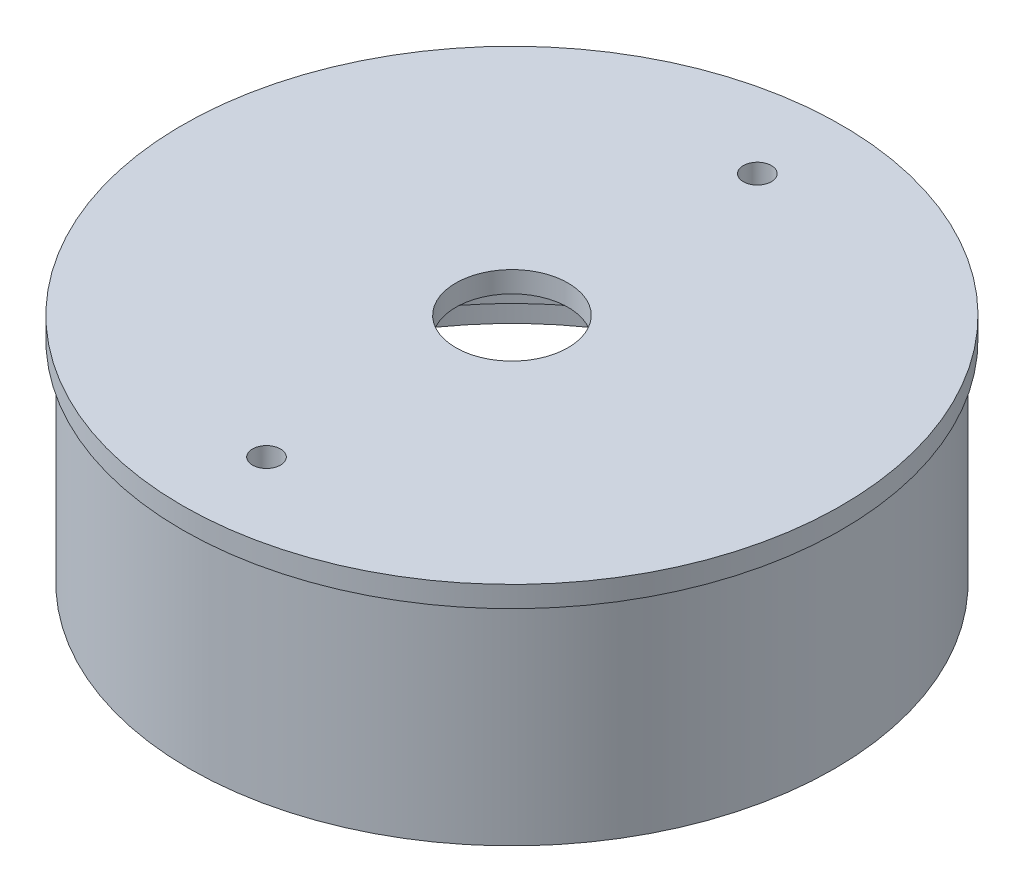
ISO-10303-21;
HEADER;
FILE_DESCRIPTION(('STEP AP214'),'2;1');
FILE_NAME('part.step','',(''),(''),'','','');
FILE_SCHEMA(('AUTOMOTIVE_DESIGN { 1 0 10303 214 1 1 1 1 }'));
ENDSEC;
DATA;
#1=APPLICATION_CONTEXT('core data for automotive mechanical design processes');
#2=APPLICATION_PROTOCOL_DEFINITION('international standard','automotive_design',2000,#1);
#3=PRODUCT_CONTEXT('',#1,'mechanical');
#4=PRODUCT('Part','Part','',(#3));
#5=PRODUCT_RELATED_PRODUCT_CATEGORY('part','',(#4));
#6=PRODUCT_DEFINITION_FORMATION('','',#4);
#7=PRODUCT_DEFINITION_CONTEXT('part definition',#1,'design');
#8=PRODUCT_DEFINITION('design','',#6,#7);
#9=PRODUCT_DEFINITION_SHAPE('','',#8);
#10=(LENGTH_UNIT() NAMED_UNIT(*) SI_UNIT(.MILLI.,.METRE.));
#11=(NAMED_UNIT(*) PLANE_ANGLE_UNIT() SI_UNIT($,.RADIAN.));
#12=(NAMED_UNIT(*) SI_UNIT($,.STERADIAN.) SOLID_ANGLE_UNIT());
#13=UNCERTAINTY_MEASURE_WITH_UNIT(LENGTH_MEASURE(1.E-05),#10,'distance_accuracy_value','');
#14=(GEOMETRIC_REPRESENTATION_CONTEXT(3) GLOBAL_UNCERTAINTY_ASSIGNED_CONTEXT((#13)) GLOBAL_UNIT_ASSIGNED_CONTEXT((#10,
#11,#12)) REPRESENTATION_CONTEXT('',''));
#15=CARTESIAN_POINT('',(0.,0.,0.));
#16=DIRECTION('',(0.,0.,1.));
#17=DIRECTION('',(1.,0.,0.));
#18=AXIS2_PLACEMENT_3D('',#15,#16,#17);
#19=CARTESIAN_POINT('',(0.,30.,0.));
#20=DIRECTION('',(0.,1.,0.));
#21=DIRECTION('',(0.,0.,1.));
#22=AXIS2_PLACEMENT_3D('',#19,#20,#21);
#23=PLANE('',#22);
#24=CARTESIAN_POINT('',(0.,30.,0.));
#25=DIRECTION('',(0.,1.,0.));
#26=DIRECTION('',(0.,0.,1.));
#27=AXIS2_PLACEMENT_3D('',#24,#25,#26);
#28=CIRCLE('',#27,8.);
#29=CARTESIAN_POINT('',(0.,30.,8.));
#30=VERTEX_POINT('',#29);
#31=EDGE_CURVE('E63',#30,#30,#28,.T.);
#32=ORIENTED_EDGE('',*,*,#31,.T.);
#33=EDGE_LOOP('',(#32));
#34=FACE_BOUND('',#33,.T.);
#35=CARTESIAN_POINT('',(0.,30.,35.));
#36=DIRECTION('',(0.,1.,0.));
#37=DIRECTION('',(0.,0.,1.));
#38=AXIS2_PLACEMENT_3D('',#35,#36,#37);
#39=CIRCLE('',#38,2.);
#40=CARTESIAN_POINT('',(0.,30.,37.));
#41=VERTEX_POINT('',#40);
#42=EDGE_CURVE('E60',#41,#41,#39,.T.);
#43=ORIENTED_EDGE('',*,*,#42,.T.);
#44=EDGE_LOOP('',(#43));
#45=FACE_BOUND('',#44,.T.);
#46=CARTESIAN_POINT('',(0.,30.,-35.));
#47=DIRECTION('',(0.,1.,0.));
#48=DIRECTION('',(0.,0.,1.));
#49=AXIS2_PLACEMENT_3D('',#46,#47,#48);
#50=CIRCLE('',#49,2.);
#51=CARTESIAN_POINT('',(0.,30.,-33.));
#52=VERTEX_POINT('',#51);
#53=EDGE_CURVE('E55',#52,#52,#50,.T.);
#54=ORIENTED_EDGE('',*,*,#53,.T.);
#55=EDGE_LOOP('',(#54));
#56=FACE_BOUND('',#55,.T.);
#57=CARTESIAN_POINT('',(0.,30.,0.));
#58=DIRECTION('',(0.,-1.,0.));
#59=DIRECTION('',(0.,0.,-1.));
#60=AXIS2_PLACEMENT_3D('',#57,#58,#59);
#61=CIRCLE('',#60,44.5);
#62=CARTESIAN_POINT('',(0.,30.,-44.5));
#63=VERTEX_POINT('',#62);
#64=EDGE_CURVE('E76',#63,#63,#61,.T.);
#65=ORIENTED_EDGE('',*,*,#64,.T.);
#66=EDGE_LOOP('',(#65));
#67=FACE_BOUND('',#66,.T.);
#68=ADVANCED_FACE('F31',(#34,#45,#56,#67),#23,.F.);
#69=CARTESIAN_POINT('',(0.,0.,0.));
#70=DIRECTION('',(0.,1.,0.));
#71=DIRECTION('',(0.,0.,1.));
#72=AXIS2_PLACEMENT_3D('',#69,#70,#71);
#73=PLANE('',#72);
#74=CARTESIAN_POINT('',(0.,0.,0.));
#75=DIRECTION('',(0.,1.,0.));
#76=DIRECTION('',(0.,0.,1.));
#77=AXIS2_PLACEMENT_3D('',#74,#75,#76);
#78=CIRCLE('',#77,46.);
#79=CARTESIAN_POINT('',(0.,0.,46.));
#80=VERTEX_POINT('',#79);
#81=EDGE_CURVE('E42',#80,#80,#78,.T.);
#82=ORIENTED_EDGE('',*,*,#81,.F.);
#83=EDGE_LOOP('',(#82));
#84=FACE_BOUND('',#83,.T.);
#85=CARTESIAN_POINT('',(0.,0.,0.));
#86=DIRECTION('',(0.,1.,0.));
#87=DIRECTION('',(0.,0.,1.));
#88=AXIS2_PLACEMENT_3D('',#85,#86,#87);
#89=CIRCLE('',#88,45.25);
#90=CARTESIAN_POINT('',(0.,0.,45.25));
#91=VERTEX_POINT('',#90);
#92=EDGE_CURVE('E47',#91,#91,#89,.T.);
#93=ORIENTED_EDGE('',*,*,#92,.T.);
#94=EDGE_LOOP('',(#93));
#95=FACE_BOUND('',#94,.T.);
#96=ADVANCED_FACE('F98',(#84,#95),#73,.F.);
#97=CARTESIAN_POINT('',(0.,30.,0.));
#98=DIRECTION('',(0.,-1.,0.));
#99=DIRECTION('',(0.,0.,-1.));
#100=AXIS2_PLACEMENT_3D('',#97,#98,#99);
#101=CYLINDRICAL_SURFACE('',#100,46.);
#102=CARTESIAN_POINT('',(0.,30.,0.));
#103=DIRECTION('',(0.,1.,0.));
#104=DIRECTION('',(0.,0.,1.));
#105=AXIS2_PLACEMENT_3D('',#102,#103,#104);
#106=CIRCLE('',#105,46.);
#107=CARTESIAN_POINT('',(0.,30.,46.));
#108=VERTEX_POINT('',#107);
#109=EDGE_CURVE('E38',#108,#108,#106,.T.);
#110=ORIENTED_EDGE('',*,*,#109,.F.);
#111=EDGE_LOOP('',(#110));
#112=FACE_BOUND('',#111,.T.);
#113=ORIENTED_EDGE('',*,*,#81,.T.);
#114=EDGE_LOOP('',(#113));
#115=FACE_BOUND('',#114,.T.);
#116=ADVANCED_FACE('F33',(#112,#115),#101,.T.);
#117=CARTESIAN_POINT('',(0.,30.,0.));
#118=DIRECTION('',(0.,-1.,0.));
#119=DIRECTION('',(0.,0.,-1.));
#120=AXIS2_PLACEMENT_3D('',#117,#118,#119);
#121=CYLINDRICAL_SURFACE('',#120,45.25);
#122=CARTESIAN_POINT('',(0.,3.,0.));
#123=DIRECTION('',(0.,-1.,0.));
#124=DIRECTION('',(0.,0.,-1.));
#125=AXIS2_PLACEMENT_3D('',#122,#123,#124);
#126=CIRCLE('',#125,45.25);
#127=CARTESIAN_POINT('',(0.,3.,-45.25));
#128=VERTEX_POINT('',#127);
#129=EDGE_CURVE('E10',#128,#128,#126,.T.);
#130=ORIENTED_EDGE('',*,*,#129,.F.);
#131=EDGE_LOOP('',(#130));
#132=FACE_BOUND('',#131,.T.);
#133=ORIENTED_EDGE('',*,*,#92,.F.);
#134=EDGE_LOOP('',(#133));
#135=FACE_BOUND('',#134,.T.);
#136=ADVANCED_FACE('F124',(#132,#135),#121,.F.);
#137=CARTESIAN_POINT('',(0.,33.,0.));
#138=DIRECTION('',(0.,-1.,0.));
#139=DIRECTION('',(0.,0.,-1.));
#140=AXIS2_PLACEMENT_3D('',#137,#138,#139);
#141=CYLINDRICAL_SURFACE('',#140,47.);
#142=CARTESIAN_POINT('',(0.,33.,0.));
#143=DIRECTION('',(0.,1.,0.));
#144=DIRECTION('',(0.,0.,1.));
#145=AXIS2_PLACEMENT_3D('',#142,#143,#144);
#146=CIRCLE('',#145,47.);
#147=CARTESIAN_POINT('',(0.,33.,47.));
#148=VERTEX_POINT('',#147);
#149=EDGE_CURVE('E51',#148,#148,#146,.T.);
#150=ORIENTED_EDGE('',*,*,#149,.F.);
#151=EDGE_LOOP('',(#150));
#152=FACE_BOUND('',#151,.T.);
#153=CARTESIAN_POINT('',(0.,30.,0.));
#154=DIRECTION('',(0.,1.,0.));
#155=DIRECTION('',(0.,0.,1.));
#156=AXIS2_PLACEMENT_3D('',#153,#154,#155);
#157=CIRCLE('',#156,47.);
#158=CARTESIAN_POINT('',(0.,30.,47.));
#159=VERTEX_POINT('',#158);
#160=EDGE_CURVE('E52',#159,#159,#157,.T.);
#161=ORIENTED_EDGE('',*,*,#160,.T.);
#162=EDGE_LOOP('',(#161));
#163=FACE_BOUND('',#162,.T.);
#164=ADVANCED_FACE('F118',(#152,#163),#141,.T.);
#165=CARTESIAN_POINT('',(0.,33.,0.));
#166=DIRECTION('',(0.,1.,0.));
#167=DIRECTION('',(0.,0.,1.));
#168=AXIS2_PLACEMENT_3D('',#165,#166,#167);
#169=PLANE('',#168);
#170=CARTESIAN_POINT('',(0.,33.,-35.));
#171=DIRECTION('',(0.,1.,0.));
#172=DIRECTION('',(0.,0.,1.));
#173=AXIS2_PLACEMENT_3D('',#170,#171,#172);
#174=CIRCLE('',#173,2.);
#175=CARTESIAN_POINT('',(0.,33.,-33.));
#176=VERTEX_POINT('',#175);
#177=EDGE_CURVE('E66',#176,#176,#174,.T.);
#178=ORIENTED_EDGE('',*,*,#177,.F.);
#179=EDGE_LOOP('',(#178));
#180=FACE_BOUND('',#179,.T.);
#181=CARTESIAN_POINT('',(0.,33.,35.));
#182=DIRECTION('',(0.,1.,0.));
#183=DIRECTION('',(0.,0.,-1.));
#184=AXIS2_PLACEMENT_3D('',#181,#182,#183);
#185=CIRCLE('',#184,2.);
#186=CARTESIAN_POINT('',(0.,33.,33.));
#187=VERTEX_POINT('',#186);
#188=EDGE_CURVE('E70',#187,#187,#185,.T.);
#189=ORIENTED_EDGE('',*,*,#188,.F.);
#190=EDGE_LOOP('',(#189));
#191=FACE_BOUND('',#190,.T.);
#192=CARTESIAN_POINT('',(0.,33.,0.));
#193=DIRECTION('',(0.,1.,0.));
#194=DIRECTION('',(0.,0.,1.));
#195=AXIS2_PLACEMENT_3D('',#192,#193,#194);
#196=CIRCLE('',#195,8.);
#197=CARTESIAN_POINT('',(0.,33.,8.));
#198=VERTEX_POINT('',#197);
#199=EDGE_CURVE('E67',#198,#198,#196,.T.);
#200=ORIENTED_EDGE('',*,*,#199,.F.);
#201=EDGE_LOOP('',(#200));
#202=FACE_BOUND('',#201,.T.);
#203=ORIENTED_EDGE('',*,*,#149,.T.);
#204=EDGE_LOOP('',(#203));
#205=FACE_BOUND('',#204,.T.);
#206=ADVANCED_FACE('F111',(#180,#191,#202,#205),#169,.T.);
#207=ORIENTED_EDGE('',*,*,#109,.T.);
#208=EDGE_LOOP('',(#207));
#209=FACE_BOUND('',#208,.T.);
#210=ORIENTED_EDGE('',*,*,#160,.F.);
#211=EDGE_LOOP('',(#210));
#212=FACE_BOUND('',#211,.T.);
#213=ADVANCED_FACE('F101',(#209,#212),#23,.F.);
#214=CARTESIAN_POINT('',(0.,0.,0.));
#215=DIRECTION('',(0.,1.,0.));
#216=DIRECTION('',(0.,0.,1.));
#217=AXIS2_PLACEMENT_3D('',#214,#215,#216);
#218=CYLINDRICAL_SURFACE('',#217,8.);
#219=ORIENTED_EDGE('',*,*,#199,.T.);
#220=EDGE_LOOP('',(#219));
#221=FACE_BOUND('',#220,.T.);
#222=ORIENTED_EDGE('',*,*,#31,.F.);
#223=EDGE_LOOP('',(#222));
#224=FACE_BOUND('',#223,.T.);
#225=ADVANCED_FACE('F110',(#221,#224),#218,.F.);
#226=CARTESIAN_POINT('',(0.,0.,35.));
#227=DIRECTION('',(0.,1.,0.));
#228=DIRECTION('',(0.,0.,1.));
#229=AXIS2_PLACEMENT_3D('',#226,#227,#228);
#230=CYLINDRICAL_SURFACE('',#229,2.);
#231=ORIENTED_EDGE('',*,*,#188,.T.);
#232=EDGE_LOOP('',(#231));
#233=FACE_BOUND('',#232,.T.);
#234=ORIENTED_EDGE('',*,*,#42,.F.);
#235=EDGE_LOOP('',(#234));
#236=FACE_BOUND('',#235,.T.);
#237=ADVANCED_FACE('F94',(#233,#236),#230,.F.);
#238=CARTESIAN_POINT('',(0.,0.,-35.));
#239=DIRECTION('',(0.,1.,0.));
#240=DIRECTION('',(0.,0.,1.));
#241=AXIS2_PLACEMENT_3D('',#238,#239,#240);
#242=CYLINDRICAL_SURFACE('',#241,2.);
#243=ORIENTED_EDGE('',*,*,#177,.T.);
#244=EDGE_LOOP('',(#243));
#245=FACE_BOUND('',#244,.T.);
#246=ORIENTED_EDGE('',*,*,#53,.F.);
#247=EDGE_LOOP('',(#246));
#248=FACE_BOUND('',#247,.T.);
#249=ADVANCED_FACE('F87',(#245,#248),#242,.F.);
#250=CARTESIAN_POINT('',(0.,3.,0.));
#251=DIRECTION('',(0.,-1.,0.));
#252=DIRECTION('',(0.,0.,-1.));
#253=AXIS2_PLACEMENT_3D('',#250,#251,#252);
#254=PLANE('',#253);
#255=ORIENTED_EDGE('',*,*,#129,.T.);
#256=EDGE_LOOP('',(#255));
#257=FACE_BOUND('',#256,.T.);
#258=CARTESIAN_POINT('',(0.,3.,0.));
#259=DIRECTION('',(0.,-1.,0.));
#260=DIRECTION('',(0.,0.,-1.));
#261=AXIS2_PLACEMENT_3D('',#258,#259,#260);
#262=CIRCLE('',#261,44.5);
#263=CARTESIAN_POINT('',(0.,3.,-44.5));
#264=VERTEX_POINT('',#263);
#265=EDGE_CURVE('E71',#264,#264,#262,.T.);
#266=ORIENTED_EDGE('',*,*,#265,.F.);
#267=EDGE_LOOP('',(#266));
#268=FACE_BOUND('',#267,.T.);
#269=ADVANCED_FACE('F85',(#257,#268),#254,.T.);
#270=CARTESIAN_POINT('',(0.,3.,0.));
#271=DIRECTION('',(0.,1.,0.));
#272=DIRECTION('',(0.,0.,1.));
#273=AXIS2_PLACEMENT_3D('',#270,#271,#272);
#274=CYLINDRICAL_SURFACE('',#273,44.5);
#275=ORIENTED_EDGE('',*,*,#265,.T.);
#276=EDGE_LOOP('',(#275));
#277=FACE_BOUND('',#276,.T.);
#278=ORIENTED_EDGE('',*,*,#64,.F.);
#279=EDGE_LOOP('',(#278));
#280=FACE_BOUND('',#279,.T.);
#281=ADVANCED_FACE('F82',(#277,#280),#274,.F.);
#282=CLOSED_SHELL('',(#68,#96,#116,#136,#164,#206,#213,#225,#237,#249,#269,#281));
#283=MANIFOLD_SOLID_BREP('B2',#282);
#284=ADVANCED_BREP_SHAPE_REPRESENTATION('',(#18,#283),#14);
#285=SHAPE_DEFINITION_REPRESENTATION(#9,#284);
ENDSEC;
END-ISO-10303-21;
